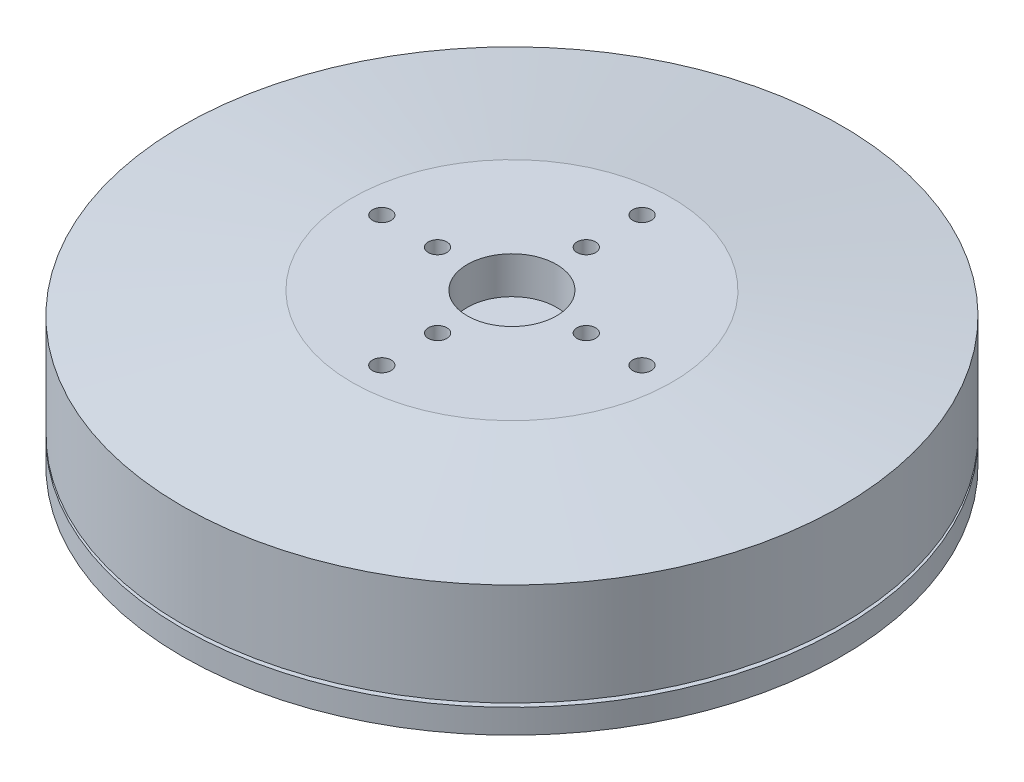
ISO-10303-21;
HEADER;
FILE_DESCRIPTION(('STEP AP214'),'2;1');
FILE_NAME('part.step','',(''),(''),'','','');
FILE_SCHEMA(('AUTOMOTIVE_DESIGN { 1 0 10303 214 1 1 1 1 }'));
ENDSEC;
DATA;
#1=APPLICATION_CONTEXT('core data for automotive mechanical design processes');
#2=APPLICATION_PROTOCOL_DEFINITION('international standard','automotive_design',2000,#1);
#3=PRODUCT_CONTEXT('',#1,'mechanical');
#4=PRODUCT('Part','Part','',(#3));
#5=PRODUCT_RELATED_PRODUCT_CATEGORY('part','',(#4));
#6=PRODUCT_DEFINITION_FORMATION('','',#4);
#7=PRODUCT_DEFINITION_CONTEXT('part definition',#1,'design');
#8=PRODUCT_DEFINITION('design','',#6,#7);
#9=PRODUCT_DEFINITION_SHAPE('','',#8);
#10=(LENGTH_UNIT() NAMED_UNIT(*) SI_UNIT(.MILLI.,.METRE.));
#11=(NAMED_UNIT(*) PLANE_ANGLE_UNIT() SI_UNIT($,.RADIAN.));
#12=(NAMED_UNIT(*) SI_UNIT($,.STERADIAN.) SOLID_ANGLE_UNIT());
#13=UNCERTAINTY_MEASURE_WITH_UNIT(LENGTH_MEASURE(1.E-05),#10,'distance_accuracy_value','');
#14=(GEOMETRIC_REPRESENTATION_CONTEXT(3) GLOBAL_UNCERTAINTY_ASSIGNED_CONTEXT((#13)) GLOBAL_UNIT_ASSIGNED_CONTEXT((#10,
#11,#12)) REPRESENTATION_CONTEXT('',''));
#15=CARTESIAN_POINT('',(0.,0.,0.));
#16=DIRECTION('',(0.,0.,1.));
#17=DIRECTION('',(1.,0.,0.));
#18=AXIS2_PLACEMENT_3D('',#15,#16,#17);
#19=CARTESIAN_POINT('',(-35.,-10.75,0.));
#20=DIRECTION('',(0.,-1.,0.));
#21=DIRECTION('',(0.,0.,-1.));
#22=AXIS2_PLACEMENT_3D('',#19,#20,#21);
#23=PLANE('',#22);
#24=CARTESIAN_POINT('',(0.,-10.75,-15.));
#25=DIRECTION('',(0.,-1.,0.));
#26=DIRECTION('',(0.,0.,-1.));
#27=AXIS2_PLACEMENT_3D('',#24,#25,#26);
#28=CIRCLE('',#27,1.24999999999999);
#29=CARTESIAN_POINT('',(0.,-10.75,-16.25));
#30=VERTEX_POINT('',#29);
#31=EDGE_CURVE('E93',#30,#30,#28,.T.);
#32=ORIENTED_EDGE('',*,*,#31,.F.);
#33=EDGE_LOOP('',(#32));
#34=FACE_BOUND('',#33,.T.);
#35=CARTESIAN_POINT('',(-15.0000000000004,-10.75,-4.24488671257339E-13));
#36=DIRECTION('',(0.,-1.,0.));
#37=DIRECTION('',(0.,0.,-1.));
#38=AXIS2_PLACEMENT_3D('',#35,#36,#37);
#39=CIRCLE('',#38,1.24999999999999);
#40=CARTESIAN_POINT('',(-15.0000000000004,-10.75,-1.25000000000041));
#41=VERTEX_POINT('',#40);
#42=EDGE_CURVE('E92',#41,#41,#39,.T.);
#43=ORIENTED_EDGE('',*,*,#42,.F.);
#44=EDGE_LOOP('',(#43));
#45=FACE_BOUND('',#44,.T.);
#46=CARTESIAN_POINT('',(-8.48977342514678E-13,-10.75,15.));
#47=DIRECTION('',(0.,-1.,0.));
#48=DIRECTION('',(0.,0.,-1.));
#49=AXIS2_PLACEMENT_3D('',#46,#47,#48);
#50=CIRCLE('',#49,1.24999999999999);
#51=CARTESIAN_POINT('',(-8.48977342514678E-13,-10.75,13.75));
#52=VERTEX_POINT('',#51);
#53=EDGE_CURVE('E103',#52,#52,#50,.T.);
#54=ORIENTED_EDGE('',*,*,#53,.F.);
#55=EDGE_LOOP('',(#54));
#56=FACE_BOUND('',#55,.T.);
#57=CARTESIAN_POINT('',(14.9999999999996,-10.75,4.22651701058618E-13));
#58=DIRECTION('',(0.,-1.,0.));
#59=DIRECTION('',(0.,0.,-1.));
#60=AXIS2_PLACEMENT_3D('',#57,#58,#59);
#61=CIRCLE('',#60,1.24999999999999);
#62=CARTESIAN_POINT('',(14.9999999999996,-10.75,-1.24999999999956));
#63=VERTEX_POINT('',#62);
#64=EDGE_CURVE('E109',#63,#63,#61,.T.);
#65=ORIENTED_EDGE('',*,*,#64,.F.);
#66=EDGE_LOOP('',(#65));
#67=FACE_BOUND('',#66,.T.);
#68=CARTESIAN_POINT('',(0.,-10.75,0.));
#69=DIRECTION('',(0.,1.,0.));
#70=DIRECTION('',(0.,0.,1.));
#71=AXIS2_PLACEMENT_3D('',#68,#69,#70);
#72=CIRCLE('',#71,35.);
#73=CARTESIAN_POINT('',(0.,-10.75,35.));
#74=VERTEX_POINT('',#73);
#75=EDGE_CURVE('E169',#74,#74,#72,.T.);
#76=ORIENTED_EDGE('',*,*,#75,.F.);
#77=EDGE_LOOP('',(#76));
#78=FACE_BOUND('',#77,.T.);
#79=ADVANCED_FACE('F38',(#34,#45,#56,#67,#78),#23,.T.);
#80=CARTESIAN_POINT('',(0.,10.75,0.));
#81=DIRECTION('',(0.,1.,0.));
#82=DIRECTION('',(0.,0.,1.));
#83=AXIS2_PLACEMENT_3D('',#80,#81,#82);
#84=PLANE('',#83);
#85=CARTESIAN_POINT('',(0.,10.75,0.));
#86=DIRECTION('',(0.,1.,0.));
#87=DIRECTION('',(0.,0.,1.));
#88=AXIS2_PLACEMENT_3D('',#85,#86,#87);
#89=CIRCLE('',#88,6.);
#90=CARTESIAN_POINT('',(0.,10.75,6.));
#91=VERTEX_POINT('',#90);
#92=EDGE_CURVE('E115',#91,#91,#89,.T.);
#93=ORIENTED_EDGE('',*,*,#92,.F.);
#94=EDGE_LOOP('',(#93));
#95=FACE_BOUND('',#94,.T.);
#96=CARTESIAN_POINT('',(0.,10.75,-17.5));
#97=DIRECTION('',(0.,1.,0.));
#98=DIRECTION('',(0.,0.,1.));
#99=AXIS2_PLACEMENT_3D('',#96,#97,#98);
#100=CIRCLE('',#99,1.24999999999999);
#101=CARTESIAN_POINT('',(0.,10.75,-16.25));
#102=VERTEX_POINT('',#101);
#103=EDGE_CURVE('E119',#102,#102,#100,.T.);
#104=ORIENTED_EDGE('',*,*,#103,.F.);
#105=EDGE_LOOP('',(#104));
#106=FACE_BOUND('',#105,.T.);
#107=CARTESIAN_POINT('',(0.,10.75,-10.));
#108=DIRECTION('',(0.,1.,0.));
#109=DIRECTION('',(0.,0.,1.));
#110=AXIS2_PLACEMENT_3D('',#107,#108,#109);
#111=CIRCLE('',#110,1.24999999999999);
#112=CARTESIAN_POINT('',(0.,10.75,-8.75000000000001));
#113=VERTEX_POINT('',#112);
#114=EDGE_CURVE('E127',#113,#113,#111,.T.);
#115=ORIENTED_EDGE('',*,*,#114,.F.);
#116=EDGE_LOOP('',(#115));
#117=FACE_BOUND('',#116,.T.);
#118=CARTESIAN_POINT('',(17.5000000000003,10.75,-2.83451690054573E-13));
#119=DIRECTION('',(0.,1.,0.));
#120=DIRECTION('',(0.,0.,1.));
#121=AXIS2_PLACEMENT_3D('',#118,#119,#120);
#122=CIRCLE('',#121,1.24999999999999);
#123=CARTESIAN_POINT('',(17.5000000000003,10.75,1.24999999999971));
#124=VERTEX_POINT('',#123);
#125=EDGE_CURVE('E133',#124,#124,#122,.T.);
#126=ORIENTED_EDGE('',*,*,#125,.F.);
#127=EDGE_LOOP('',(#126));
#128=FACE_BOUND('',#127,.T.);
#129=CARTESIAN_POINT('',(10.0000000000003,10.75,-2.82992447504893E-13));
#130=DIRECTION('',(0.,1.,0.));
#131=DIRECTION('',(0.,0.,1.));
#132=AXIS2_PLACEMENT_3D('',#129,#130,#131);
#133=CIRCLE('',#132,1.24999999999999);
#134=CARTESIAN_POINT('',(10.0000000000003,10.75,1.24999999999971));
#135=VERTEX_POINT('',#134);
#136=EDGE_CURVE('E139',#135,#135,#133,.T.);
#137=ORIENTED_EDGE('',*,*,#136,.F.);
#138=EDGE_LOOP('',(#137));
#139=FACE_BOUND('',#138,.T.);
#140=CARTESIAN_POINT('',(5.66903380109146E-13,10.75,17.5));
#141=DIRECTION('',(0.,1.,0.));
#142=DIRECTION('',(0.,0.,1.));
#143=AXIS2_PLACEMENT_3D('',#140,#141,#142);
#144=CIRCLE('',#143,1.24999999999999);
#145=CARTESIAN_POINT('',(5.66903380109146E-13,10.75,18.75));
#146=VERTEX_POINT('',#145);
#147=EDGE_CURVE('E145',#146,#146,#144,.T.);
#148=ORIENTED_EDGE('',*,*,#147,.F.);
#149=EDGE_LOOP('',(#148));
#150=FACE_BOUND('',#149,.T.);
#151=CARTESIAN_POINT('',(5.65984895009786E-13,10.75,10.));
#152=DIRECTION('',(0.,1.,0.));
#153=DIRECTION('',(0.,0.,1.));
#154=AXIS2_PLACEMENT_3D('',#151,#152,#153);
#155=CIRCLE('',#154,1.24999999999999);
#156=CARTESIAN_POINT('',(5.65984895009786E-13,10.75,11.25));
#157=VERTEX_POINT('',#156);
#158=EDGE_CURVE('E151',#157,#157,#155,.T.);
#159=ORIENTED_EDGE('',*,*,#158,.F.);
#160=EDGE_LOOP('',(#159));
#161=FACE_BOUND('',#160,.T.);
#162=CARTESIAN_POINT('',(-17.4999999999997,10.75,2.81308558156065E-13));
#163=DIRECTION('',(0.,1.,0.));
#164=DIRECTION('',(0.,0.,1.));
#165=AXIS2_PLACEMENT_3D('',#162,#163,#164);
#166=CIRCLE('',#165,1.24999999999999);
#167=CARTESIAN_POINT('',(-17.4999999999997,10.75,1.25000000000027));
#168=VERTEX_POINT('',#167);
#169=EDGE_CURVE('E157',#168,#168,#166,.T.);
#170=ORIENTED_EDGE('',*,*,#169,.F.);
#171=EDGE_LOOP('',(#170));
#172=FACE_BOUND('',#171,.T.);
#173=CARTESIAN_POINT('',(-9.99999999999972,10.75,2.81767800705745E-13));
#174=DIRECTION('',(0.,1.,0.));
#175=DIRECTION('',(0.,0.,1.));
#176=AXIS2_PLACEMENT_3D('',#173,#174,#175);
#177=CIRCLE('',#176,1.24999999999999);
#178=CARTESIAN_POINT('',(-9.99999999999972,10.75,1.25000000000027));
#179=VERTEX_POINT('',#178);
#180=EDGE_CURVE('E163',#179,#179,#177,.T.);
#181=ORIENTED_EDGE('',*,*,#180,.F.);
#182=EDGE_LOOP('',(#181));
#183=FACE_BOUND('',#182,.T.);
#184=CARTESIAN_POINT('',(0.,10.75,0.));
#185=DIRECTION('',(0.,1.,0.));
#186=DIRECTION('',(0.,0.,1.));
#187=AXIS2_PLACEMENT_3D('',#184,#185,#186);
#188=CIRCLE('',#187,21.5);
#189=CARTESIAN_POINT('',(0.,10.75,21.5));
#190=VERTEX_POINT('',#189);
#191=EDGE_CURVE('E11',#190,#190,#188,.T.);
#192=ORIENTED_EDGE('',*,*,#191,.T.);
#193=EDGE_LOOP('',(#192));
#194=FACE_BOUND('',#193,.T.);
#195=ADVANCED_FACE('F204',(#95,#106,#117,#128,#139,#150,#161,#172,#183,#194),#84,.T.);
#196=CARTESIAN_POINT('',(0.,10.75,0.));
#197=DIRECTION('',(0.,-1.,0.));
#198=DIRECTION('',(0.,0.,-1.));
#199=AXIS2_PLACEMENT_3D('',#196,#197,#198);
#200=CONICAL_SURFACE('',#199,21.5,1.44011059785878);
#201=CARTESIAN_POINT('',(0.,7.75,0.));
#202=DIRECTION('',(0.,1.,0.));
#203=DIRECTION('',(0.,0.,1.));
#204=AXIS2_PLACEMENT_3D('',#201,#202,#203);
#205=CIRCLE('',#204,44.325);
#206=CARTESIAN_POINT('',(0.,7.75,44.325));
#207=VERTEX_POINT('',#206);
#208=EDGE_CURVE('E45',#207,#207,#205,.T.);
#209=ORIENTED_EDGE('',*,*,#208,.T.);
#210=EDGE_LOOP('',(#209));
#211=FACE_BOUND('',#210,.T.);
#212=ORIENTED_EDGE('',*,*,#191,.F.);
#213=EDGE_LOOP('',(#212));
#214=FACE_BOUND('',#213,.T.);
#215=ADVANCED_FACE('F189',(#211,#214),#200,.T.);
#216=CARTESIAN_POINT('',(0.,0.,0.));
#217=DIRECTION('',(0.,1.,0.));
#218=DIRECTION('',(0.,0.,1.));
#219=AXIS2_PLACEMENT_3D('',#216,#217,#218);
#220=CYLINDRICAL_SURFACE('',#219,44.325);
#221=CARTESIAN_POINT('',(0.,-6.,0.));
#222=DIRECTION('',(0.,1.,0.));
#223=DIRECTION('',(0.,0.,1.));
#224=AXIS2_PLACEMENT_3D('',#221,#222,#223);
#225=CIRCLE('',#224,44.325);
#226=CARTESIAN_POINT('',(0.,-6.,44.325));
#227=VERTEX_POINT('',#226);
#228=EDGE_CURVE('E184',#227,#227,#225,.T.);
#229=ORIENTED_EDGE('',*,*,#228,.T.);
#230=EDGE_LOOP('',(#229));
#231=FACE_BOUND('',#230,.T.);
#232=ORIENTED_EDGE('',*,*,#208,.F.);
#233=EDGE_LOOP('',(#232));
#234=FACE_BOUND('',#233,.T.);
#235=ADVANCED_FACE('F192',(#231,#234),#220,.T.);
#236=CARTESIAN_POINT('',(-44.325,-6.,0.));
#237=DIRECTION('',(0.,-1.,0.));
#238=DIRECTION('',(0.,0.,-1.));
#239=AXIS2_PLACEMENT_3D('',#236,#237,#238);
#240=PLANE('',#239);
#241=CARTESIAN_POINT('',(0.,-6.,0.));
#242=DIRECTION('',(0.,1.,0.));
#243=DIRECTION('',(0.,0.,1.));
#244=AXIS2_PLACEMENT_3D('',#241,#242,#243);
#245=CIRCLE('',#244,40.7624999999992);
#246=CARTESIAN_POINT('',(0.,-6.,40.7624999999992));
#247=VERTEX_POINT('',#246);
#248=EDGE_CURVE('E181',#247,#247,#245,.T.);
#249=ORIENTED_EDGE('',*,*,#248,.T.);
#250=EDGE_LOOP('',(#249));
#251=FACE_BOUND('',#250,.T.);
#252=ORIENTED_EDGE('',*,*,#228,.F.);
#253=EDGE_LOOP('',(#252));
#254=FACE_BOUND('',#253,.T.);
#255=ADVANCED_FACE('F194',(#251,#254),#240,.T.);
#256=CARTESIAN_POINT('',(0.,0.,0.));
#257=DIRECTION('',(0.,1.,0.));
#258=DIRECTION('',(0.,0.,1.));
#259=AXIS2_PLACEMENT_3D('',#256,#257,#258);
#260=CYLINDRICAL_SURFACE('',#259,40.7624999999992);
#261=CARTESIAN_POINT('',(0.,-6.5,0.));
#262=DIRECTION('',(0.,1.,0.));
#263=DIRECTION('',(0.,0.,1.));
#264=AXIS2_PLACEMENT_3D('',#261,#262,#263);
#265=CIRCLE('',#264,40.7624999999992);
#266=CARTESIAN_POINT('',(0.,-6.5,40.7624999999992));
#267=VERTEX_POINT('',#266);
#268=EDGE_CURVE('E178',#267,#267,#265,.T.);
#269=ORIENTED_EDGE('',*,*,#268,.T.);
#270=EDGE_LOOP('',(#269));
#271=FACE_BOUND('',#270,.T.);
#272=ORIENTED_EDGE('',*,*,#248,.F.);
#273=EDGE_LOOP('',(#272));
#274=FACE_BOUND('',#273,.T.);
#275=ADVANCED_FACE('F201',(#271,#274),#260,.T.);
#276=CARTESIAN_POINT('',(-40.7624999999992,-6.5,0.));
#277=DIRECTION('',(0.,1.,0.));
#278=DIRECTION('',(0.,0.,1.));
#279=AXIS2_PLACEMENT_3D('',#276,#277,#278);
#280=PLANE('',#279);
#281=CARTESIAN_POINT('',(0.,-6.5,0.));
#282=DIRECTION('',(0.,1.,0.));
#283=DIRECTION('',(0.,0.,1.));
#284=AXIS2_PLACEMENT_3D('',#281,#282,#283);
#285=CIRCLE('',#284,44.325);
#286=CARTESIAN_POINT('',(0.,-6.5,44.325));
#287=VERTEX_POINT('',#286);
#288=EDGE_CURVE('E175',#287,#287,#285,.T.);
#289=ORIENTED_EDGE('',*,*,#288,.T.);
#290=EDGE_LOOP('',(#289));
#291=FACE_BOUND('',#290,.T.);
#292=ORIENTED_EDGE('',*,*,#268,.F.);
#293=EDGE_LOOP('',(#292));
#294=FACE_BOUND('',#293,.T.);
#295=ADVANCED_FACE('F232',(#291,#294),#280,.T.);
#296=CARTESIAN_POINT('',(0.,0.,0.));
#297=DIRECTION('',(0.,1.,0.));
#298=DIRECTION('',(0.,0.,1.));
#299=AXIS2_PLACEMENT_3D('',#296,#297,#298);
#300=CYLINDRICAL_SURFACE('',#299,44.325);
#301=CARTESIAN_POINT('',(0.,-9.75,0.));
#302=DIRECTION('',(0.,1.,0.));
#303=DIRECTION('',(0.,0.,1.));
#304=AXIS2_PLACEMENT_3D('',#301,#302,#303);
#305=CIRCLE('',#304,44.325);
#306=CARTESIAN_POINT('',(0.,-9.75,44.325));
#307=VERTEX_POINT('',#306);
#308=EDGE_CURVE('E172',#307,#307,#305,.T.);
#309=ORIENTED_EDGE('',*,*,#308,.T.);
#310=EDGE_LOOP('',(#309));
#311=FACE_BOUND('',#310,.T.);
#312=ORIENTED_EDGE('',*,*,#288,.F.);
#313=EDGE_LOOP('',(#312));
#314=FACE_BOUND('',#313,.T.);
#315=ADVANCED_FACE('F226',(#311,#314),#300,.T.);
#316=CARTESIAN_POINT('',(0.,-9.75,0.));
#317=DIRECTION('',(0.,1.,0.));
#318=DIRECTION('',(0.,0.,1.));
#319=AXIS2_PLACEMENT_3D('',#316,#317,#318);
#320=CONICAL_SURFACE('',#319,44.325,1.46396599303283);
#321=ORIENTED_EDGE('',*,*,#75,.T.);
#322=EDGE_LOOP('',(#321));
#323=FACE_BOUND('',#322,.T.);
#324=ORIENTED_EDGE('',*,*,#308,.F.);
#325=EDGE_LOOP('',(#324));
#326=FACE_BOUND('',#325,.T.);
#327=ADVANCED_FACE('F222',(#323,#326),#320,.T.);
#328=CARTESIAN_POINT('',(-9.99999999999972,4.25,2.81767800705745E-13));
#329=DIRECTION('',(0.,1.,0.));
#330=DIRECTION('',(0.,0.,1.));
#331=AXIS2_PLACEMENT_3D('',#328,#329,#330);
#332=CONICAL_SURFACE('',#331,1.25,1.02974425867665);
#333=CARTESIAN_POINT('',(-9.99999999999972,3.49892422621555,2.81767800705745E-13));
#334=VERTEX_POINT('',#333);
#335=VERTEX_LOOP('',#334);
#336=FACE_BOUND('',#335,.T.);
#337=CARTESIAN_POINT('',(-9.99999999999972,4.25,2.81767800705745E-13));
#338=DIRECTION('',(0.,1.,0.));
#339=DIRECTION('',(0.,0.,1.));
#340=AXIS2_PLACEMENT_3D('',#337,#338,#339);
#341=CIRCLE('',#340,1.25);
#342=CARTESIAN_POINT('',(-9.99999999999972,4.25,1.25000000000028));
#343=VERTEX_POINT('',#342);
#344=EDGE_CURVE('E166',#343,#343,#341,.T.);
#345=ORIENTED_EDGE('',*,*,#344,.T.);
#346=EDGE_LOOP('',(#345));
#347=FACE_BOUND('',#346,.T.);
#348=ADVANCED_FACE('F225',(#336,#347),#332,.F.);
#349=CARTESIAN_POINT('',(-9.99999999999972,10.75,2.81767800705745E-13));
#350=DIRECTION('',(0.,1.,0.));
#351=DIRECTION('',(0.,0.,1.));
#352=AXIS2_PLACEMENT_3D('',#349,#350,#351);
#353=CYLINDRICAL_SURFACE('',#352,1.24999999999999);
#354=ORIENTED_EDGE('',*,*,#344,.F.);
#355=EDGE_LOOP('',(#354));
#356=FACE_BOUND('',#355,.T.);
#357=ORIENTED_EDGE('',*,*,#180,.T.);
#358=EDGE_LOOP('',(#357));
#359=FACE_BOUND('',#358,.T.);
#360=ADVANCED_FACE('F252',(#356,#359),#353,.F.);
#361=CARTESIAN_POINT('',(-17.4999999999997,4.25,2.81308558156065E-13));
#362=DIRECTION('',(0.,1.,0.));
#363=DIRECTION('',(0.,0.,1.));
#364=AXIS2_PLACEMENT_3D('',#361,#362,#363);
#365=CONICAL_SURFACE('',#364,1.25,1.02974425867665);
#366=CARTESIAN_POINT('',(-17.4999999999997,3.49892422621555,2.81308558156065E-13));
#367=VERTEX_POINT('',#366);
#368=VERTEX_LOOP('',#367);
#369=FACE_BOUND('',#368,.T.);
#370=CARTESIAN_POINT('',(-17.4999999999997,4.25,2.81308558156065E-13));
#371=DIRECTION('',(0.,1.,0.));
#372=DIRECTION('',(0.,0.,1.));
#373=AXIS2_PLACEMENT_3D('',#370,#371,#372);
#374=CIRCLE('',#373,1.25);
#375=CARTESIAN_POINT('',(-17.4999999999997,4.25,1.25000000000028));
#376=VERTEX_POINT('',#375);
#377=EDGE_CURVE('E160',#376,#376,#374,.T.);
#378=ORIENTED_EDGE('',*,*,#377,.T.);
#379=EDGE_LOOP('',(#378));
#380=FACE_BOUND('',#379,.T.);
#381=ADVANCED_FACE('F255',(#369,#380),#365,.F.);
#382=CARTESIAN_POINT('',(-17.4999999999997,10.75,2.81308558156065E-13));
#383=DIRECTION('',(0.,1.,0.));
#384=DIRECTION('',(0.,0.,1.));
#385=AXIS2_PLACEMENT_3D('',#382,#383,#384);
#386=CYLINDRICAL_SURFACE('',#385,1.24999999999999);
#387=ORIENTED_EDGE('',*,*,#377,.F.);
#388=EDGE_LOOP('',(#387));
#389=FACE_BOUND('',#388,.T.);
#390=ORIENTED_EDGE('',*,*,#169,.T.);
#391=EDGE_LOOP('',(#390));
#392=FACE_BOUND('',#391,.T.);
#393=ADVANCED_FACE('F259',(#389,#392),#386,.F.);
#394=CARTESIAN_POINT('',(5.65984895009786E-13,4.25,10.));
#395=DIRECTION('',(0.,1.,0.));
#396=DIRECTION('',(0.,0.,1.));
#397=AXIS2_PLACEMENT_3D('',#394,#395,#396);
#398=CONICAL_SURFACE('',#397,1.25,1.02974425867665);
#399=CARTESIAN_POINT('',(5.64208893662437E-13,3.49892422621555,10.));
#400=VERTEX_POINT('',#399);
#401=VERTEX_LOOP('',#400);
#402=FACE_BOUND('',#401,.T.);
#403=CARTESIAN_POINT('',(5.65984895009786E-13,4.25,10.));
#404=DIRECTION('',(0.,1.,0.));
#405=DIRECTION('',(0.,0.,1.));
#406=AXIS2_PLACEMENT_3D('',#403,#404,#405);
#407=CIRCLE('',#406,1.25);
#408=CARTESIAN_POINT('',(5.65984895009786E-13,4.25,11.25));
#409=VERTEX_POINT('',#408);
#410=EDGE_CURVE('E154',#409,#409,#407,.T.);
#411=ORIENTED_EDGE('',*,*,#410,.T.);
#412=EDGE_LOOP('',(#411));
#413=FACE_BOUND('',#412,.T.);
#414=ADVANCED_FACE('F262',(#402,#413),#398,.F.);
#415=CARTESIAN_POINT('',(5.65984895009786E-13,10.75,10.));
#416=DIRECTION('',(0.,1.,0.));
#417=DIRECTION('',(0.,0.,1.));
#418=AXIS2_PLACEMENT_3D('',#415,#416,#417);
#419=CYLINDRICAL_SURFACE('',#418,1.24999999999999);
#420=ORIENTED_EDGE('',*,*,#410,.F.);
#421=EDGE_LOOP('',(#420));
#422=FACE_BOUND('',#421,.T.);
#423=ORIENTED_EDGE('',*,*,#158,.T.);
#424=EDGE_LOOP('',(#423));
#425=FACE_BOUND('',#424,.T.);
#426=ADVANCED_FACE('F266',(#422,#425),#419,.F.);
#427=CARTESIAN_POINT('',(5.66903380109146E-13,4.25,17.5));
#428=DIRECTION('',(0.,1.,0.));
#429=DIRECTION('',(0.,0.,1.));
#430=AXIS2_PLACEMENT_3D('',#427,#428,#429);
#431=CONICAL_SURFACE('',#430,1.25,1.02974425867665);
#432=CARTESIAN_POINT('',(5.65127378761798E-13,3.49892422621555,17.5));
#433=VERTEX_POINT('',#432);
#434=VERTEX_LOOP('',#433);
#435=FACE_BOUND('',#434,.T.);
#436=CARTESIAN_POINT('',(5.66903380109146E-13,4.25,17.5));
#437=DIRECTION('',(0.,1.,0.));
#438=DIRECTION('',(0.,0.,1.));
#439=AXIS2_PLACEMENT_3D('',#436,#437,#438);
#440=CIRCLE('',#439,1.25);
#441=CARTESIAN_POINT('',(5.66903380109146E-13,4.25,18.75));
#442=VERTEX_POINT('',#441);
#443=EDGE_CURVE('E148',#442,#442,#440,.T.);
#444=ORIENTED_EDGE('',*,*,#443,.T.);
#445=EDGE_LOOP('',(#444));
#446=FACE_BOUND('',#445,.T.);
#447=ADVANCED_FACE('F270',(#435,#446),#431,.F.);
#448=CARTESIAN_POINT('',(5.66903380109146E-13,10.75,17.5));
#449=DIRECTION('',(0.,1.,0.));
#450=DIRECTION('',(0.,0.,1.));
#451=AXIS2_PLACEMENT_3D('',#448,#449,#450);
#452=CYLINDRICAL_SURFACE('',#451,1.24999999999999);
#453=ORIENTED_EDGE('',*,*,#443,.F.);
#454=EDGE_LOOP('',(#453));
#455=FACE_BOUND('',#454,.T.);
#456=ORIENTED_EDGE('',*,*,#147,.T.);
#457=EDGE_LOOP('',(#456));
#458=FACE_BOUND('',#457,.T.);
#459=ADVANCED_FACE('F274',(#455,#458),#452,.F.);
#460=CARTESIAN_POINT('',(10.0000000000003,4.25,-2.82992447504893E-13));
#461=DIRECTION('',(0.,1.,0.));
#462=DIRECTION('',(0.,0.,1.));
#463=AXIS2_PLACEMENT_3D('',#460,#461,#462);
#464=CONICAL_SURFACE('',#463,1.25,1.02974425867665);
#465=CARTESIAN_POINT('',(10.0000000000003,3.49892422621555,-2.82992447504893E-13));
#466=VERTEX_POINT('',#465);
#467=VERTEX_LOOP('',#466);
#468=FACE_BOUND('',#467,.T.);
#469=CARTESIAN_POINT('',(10.0000000000003,4.25,-2.82992447504893E-13));
#470=DIRECTION('',(0.,1.,0.));
#471=DIRECTION('',(0.,0.,1.));
#472=AXIS2_PLACEMENT_3D('',#469,#470,#471);
#473=CIRCLE('',#472,1.25);
#474=CARTESIAN_POINT('',(10.0000000000003,4.25,1.24999999999971));
#475=VERTEX_POINT('',#474);
#476=EDGE_CURVE('E142',#475,#475,#473,.T.);
#477=ORIENTED_EDGE('',*,*,#476,.T.);
#478=EDGE_LOOP('',(#477));
#479=FACE_BOUND('',#478,.T.);
#480=ADVANCED_FACE('F278',(#468,#479),#464,.F.);
#481=CARTESIAN_POINT('',(10.0000000000003,10.75,-2.82992447504893E-13));
#482=DIRECTION('',(0.,1.,0.));
#483=DIRECTION('',(0.,0.,1.));
#484=AXIS2_PLACEMENT_3D('',#481,#482,#483);
#485=CYLINDRICAL_SURFACE('',#484,1.24999999999999);
#486=ORIENTED_EDGE('',*,*,#476,.F.);
#487=EDGE_LOOP('',(#486));
#488=FACE_BOUND('',#487,.T.);
#489=ORIENTED_EDGE('',*,*,#136,.T.);
#490=EDGE_LOOP('',(#489));
#491=FACE_BOUND('',#490,.T.);
#492=ADVANCED_FACE('F282',(#488,#491),#485,.F.);
#493=CARTESIAN_POINT('',(17.5000000000003,4.25,-2.83451690054573E-13));
#494=DIRECTION('',(0.,1.,0.));
#495=DIRECTION('',(0.,0.,1.));
#496=AXIS2_PLACEMENT_3D('',#493,#494,#495);
#497=CONICAL_SURFACE('',#496,1.25,1.02974425867665);
#498=CARTESIAN_POINT('',(17.5000000000003,3.49892422621555,-2.83451690054573E-13));
#499=VERTEX_POINT('',#498);
#500=VERTEX_LOOP('',#499);
#501=FACE_BOUND('',#500,.T.);
#502=CARTESIAN_POINT('',(17.5000000000003,4.25,-2.83451690054573E-13));
#503=DIRECTION('',(0.,1.,0.));
#504=DIRECTION('',(0.,0.,1.));
#505=AXIS2_PLACEMENT_3D('',#502,#503,#504);
#506=CIRCLE('',#505,1.25);
#507=CARTESIAN_POINT('',(17.5000000000003,4.25,1.24999999999971));
#508=VERTEX_POINT('',#507);
#509=EDGE_CURVE('E136',#508,#508,#506,.T.);
#510=ORIENTED_EDGE('',*,*,#509,.T.);
#511=EDGE_LOOP('',(#510));
#512=FACE_BOUND('',#511,.T.);
#513=ADVANCED_FACE('F286',(#501,#512),#497,.F.);
#514=CARTESIAN_POINT('',(17.5000000000003,10.75,-2.83451690054573E-13));
#515=DIRECTION('',(0.,1.,0.));
#516=DIRECTION('',(0.,0.,1.));
#517=AXIS2_PLACEMENT_3D('',#514,#515,#516);
#518=CYLINDRICAL_SURFACE('',#517,1.24999999999999);
#519=ORIENTED_EDGE('',*,*,#509,.F.);
#520=EDGE_LOOP('',(#519));
#521=FACE_BOUND('',#520,.T.);
#522=ORIENTED_EDGE('',*,*,#125,.T.);
#523=EDGE_LOOP('',(#522));
#524=FACE_BOUND('',#523,.T.);
#525=ADVANCED_FACE('F290',(#521,#524),#518,.F.);
#526=CARTESIAN_POINT('',(0.,4.25,-10.));
#527=DIRECTION('',(0.,1.,0.));
#528=DIRECTION('',(0.,0.,1.));
#529=AXIS2_PLACEMENT_3D('',#526,#527,#528);
#530=CONICAL_SURFACE('',#529,1.25,1.02974425867665);
#531=CARTESIAN_POINT('',(0.,3.49892422621555,-10.));
#532=VERTEX_POINT('',#531);
#533=VERTEX_LOOP('',#532);
#534=FACE_BOUND('',#533,.T.);
#535=CARTESIAN_POINT('',(0.,4.25,-10.));
#536=DIRECTION('',(0.,1.,0.));
#537=DIRECTION('',(0.,0.,1.));
#538=AXIS2_PLACEMENT_3D('',#535,#536,#537);
#539=CIRCLE('',#538,1.25);
#540=CARTESIAN_POINT('',(0.,4.25,-8.75));
#541=VERTEX_POINT('',#540);
#542=EDGE_CURVE('E130',#541,#541,#539,.T.);
#543=ORIENTED_EDGE('',*,*,#542,.T.);
#544=EDGE_LOOP('',(#543));
#545=FACE_BOUND('',#544,.T.);
#546=ADVANCED_FACE('F294',(#534,#545),#530,.F.);
#547=CARTESIAN_POINT('',(0.,10.75,-10.));
#548=DIRECTION('',(0.,1.,0.));
#549=DIRECTION('',(0.,0.,1.));
#550=AXIS2_PLACEMENT_3D('',#547,#548,#549);
#551=CYLINDRICAL_SURFACE('',#550,1.24999999999999);
#552=ORIENTED_EDGE('',*,*,#542,.F.);
#553=EDGE_LOOP('',(#552));
#554=FACE_BOUND('',#553,.T.);
#555=ORIENTED_EDGE('',*,*,#114,.T.);
#556=EDGE_LOOP('',(#555));
#557=FACE_BOUND('',#556,.T.);
#558=ADVANCED_FACE('F298',(#554,#557),#551,.F.);
#559=CARTESIAN_POINT('',(0.,4.25,-17.5));
#560=DIRECTION('',(0.,1.,0.));
#561=DIRECTION('',(0.,0.,1.));
#562=AXIS2_PLACEMENT_3D('',#559,#560,#561);
#563=CONICAL_SURFACE('',#562,1.25,1.02974425867665);
#564=CARTESIAN_POINT('',(0.,3.49892422621555,-17.5));
#565=VERTEX_POINT('',#564);
#566=VERTEX_LOOP('',#565);
#567=FACE_BOUND('',#566,.T.);
#568=CARTESIAN_POINT('',(0.,4.25,-17.5));
#569=DIRECTION('',(0.,1.,0.));
#570=DIRECTION('',(0.,0.,1.));
#571=AXIS2_PLACEMENT_3D('',#568,#569,#570);
#572=CIRCLE('',#571,1.25);
#573=CARTESIAN_POINT('',(0.,4.25,-16.25));
#574=VERTEX_POINT('',#573);
#575=EDGE_CURVE('E124',#574,#574,#572,.T.);
#576=ORIENTED_EDGE('',*,*,#575,.T.);
#577=EDGE_LOOP('',(#576));
#578=FACE_BOUND('',#577,.T.);
#579=ADVANCED_FACE('F302',(#567,#578),#563,.F.);
#580=CARTESIAN_POINT('',(0.,10.75,-17.5));
#581=DIRECTION('',(0.,1.,0.));
#582=DIRECTION('',(0.,0.,1.));
#583=AXIS2_PLACEMENT_3D('',#580,#581,#582);
#584=CYLINDRICAL_SURFACE('',#583,1.24999999999999);
#585=ORIENTED_EDGE('',*,*,#575,.F.);
#586=EDGE_LOOP('',(#585));
#587=FACE_BOUND('',#586,.T.);
#588=ORIENTED_EDGE('',*,*,#103,.T.);
#589=EDGE_LOOP('',(#588));
#590=FACE_BOUND('',#589,.T.);
#591=ADVANCED_FACE('F306',(#587,#590),#584,.F.);
#592=CARTESIAN_POINT('',(0.,5.75,0.));
#593=DIRECTION('',(0.,1.,0.));
#594=DIRECTION('',(0.,0.,1.));
#595=AXIS2_PLACEMENT_3D('',#592,#593,#594);
#596=CYLINDRICAL_SURFACE('',#595,6.);
#597=CARTESIAN_POINT('',(0.,5.75,0.));
#598=DIRECTION('',(0.,1.,0.));
#599=DIRECTION('',(0.,0.,1.));
#600=AXIS2_PLACEMENT_3D('',#597,#598,#599);
#601=CIRCLE('',#600,6.);
#602=CARTESIAN_POINT('',(0.,5.75,6.));
#603=VERTEX_POINT('',#602);
#604=EDGE_CURVE('E116',#603,#603,#601,.T.);
#605=ORIENTED_EDGE('',*,*,#604,.F.);
#606=EDGE_LOOP('',(#605));
#607=FACE_BOUND('',#606,.T.);
#608=ORIENTED_EDGE('',*,*,#92,.T.);
#609=EDGE_LOOP('',(#608));
#610=FACE_BOUND('',#609,.T.);
#611=ADVANCED_FACE('F310',(#607,#610),#596,.F.);
#612=CARTESIAN_POINT('',(0.,5.75,0.));
#613=DIRECTION('',(0.,1.,0.));
#614=DIRECTION('',(0.,0.,1.));
#615=AXIS2_PLACEMENT_3D('',#612,#613,#614);
#616=PLANE('',#615);
#617=ORIENTED_EDGE('',*,*,#604,.T.);
#618=EDGE_LOOP('',(#617));
#619=FACE_BOUND('',#618,.T.);
#620=ADVANCED_FACE('F314',(#619),#616,.T.);
#621=CARTESIAN_POINT('',(14.9999999999996,-4.24999999999999,4.22651701058618E-13));
#622=DIRECTION('',(0.,-1.,0.));
#623=DIRECTION('',(0.,0.,-1.));
#624=AXIS2_PLACEMENT_3D('',#621,#622,#623);
#625=CONICAL_SURFACE('',#624,1.24999999999999,1.02974425867665);
#626=CARTESIAN_POINT('',(14.9999999999996,-3.49892422621555,4.22651701058618E-13));
#627=VERTEX_POINT('',#626);
#628=VERTEX_LOOP('',#627);
#629=FACE_BOUND('',#628,.T.);
#630=CARTESIAN_POINT('',(14.9999999999996,-4.24999999999999,4.22651701058618E-13));
#631=DIRECTION('',(0.,-1.,0.));
#632=DIRECTION('',(0.,0.,-1.));
#633=AXIS2_PLACEMENT_3D('',#630,#631,#632);
#634=CIRCLE('',#633,1.24999999999999);
#635=CARTESIAN_POINT('',(14.9999999999996,-4.24999999999999,-1.24999999999956));
#636=VERTEX_POINT('',#635);
#637=EDGE_CURVE('E112',#636,#636,#634,.T.);
#638=ORIENTED_EDGE('',*,*,#637,.T.);
#639=EDGE_LOOP('',(#638));
#640=FACE_BOUND('',#639,.T.);
#641=ADVANCED_FACE('F318',(#629,#640),#625,.F.);
#642=CARTESIAN_POINT('',(14.9999999999996,-10.75,4.22651701058618E-13));
#643=DIRECTION('',(0.,-1.,0.));
#644=DIRECTION('',(0.,0.,-1.));
#645=AXIS2_PLACEMENT_3D('',#642,#643,#644);
#646=CYLINDRICAL_SURFACE('',#645,1.24999999999999);
#647=ORIENTED_EDGE('',*,*,#637,.F.);
#648=EDGE_LOOP('',(#647));
#649=FACE_BOUND('',#648,.T.);
#650=ORIENTED_EDGE('',*,*,#64,.T.);
#651=EDGE_LOOP('',(#650));
#652=FACE_BOUND('',#651,.T.);
#653=ADVANCED_FACE('F322',(#649,#652),#646,.F.);
#654=CARTESIAN_POINT('',(-8.48977342514678E-13,-4.24999999999999,15.));
#655=DIRECTION('',(0.,-1.,0.));
#656=DIRECTION('',(0.,0.,-1.));
#657=AXIS2_PLACEMENT_3D('',#654,#655,#656);
#658=CONICAL_SURFACE('',#657,1.24999999999999,1.02974425867665);
#659=CARTESIAN_POINT('',(-8.50372479029757E-13,-3.49892422621555,15.));
#660=VERTEX_POINT('',#659);
#661=VERTEX_LOOP('',#660);
#662=FACE_BOUND('',#661,.T.);
#663=CARTESIAN_POINT('',(-8.48977342514678E-13,-4.24999999999999,15.));
#664=DIRECTION('',(0.,-1.,0.));
#665=DIRECTION('',(0.,0.,-1.));
#666=AXIS2_PLACEMENT_3D('',#663,#664,#665);
#667=CIRCLE('',#666,1.24999999999999);
#668=CARTESIAN_POINT('',(-8.48977342514678E-13,-4.24999999999999,13.75));
#669=VERTEX_POINT('',#668);
#670=EDGE_CURVE('E106',#669,#669,#667,.T.);
#671=ORIENTED_EDGE('',*,*,#670,.T.);
#672=EDGE_LOOP('',(#671));
#673=FACE_BOUND('',#672,.T.);
#674=ADVANCED_FACE('F326',(#662,#673),#658,.F.);
#675=CARTESIAN_POINT('',(-8.48977342514678E-13,-10.75,15.));
#676=DIRECTION('',(0.,-1.,0.));
#677=DIRECTION('',(0.,0.,-1.));
#678=AXIS2_PLACEMENT_3D('',#675,#676,#677);
#679=CYLINDRICAL_SURFACE('',#678,1.24999999999999);
#680=ORIENTED_EDGE('',*,*,#670,.F.);
#681=EDGE_LOOP('',(#680));
#682=FACE_BOUND('',#681,.T.);
#683=ORIENTED_EDGE('',*,*,#53,.T.);
#684=EDGE_LOOP('',(#683));
#685=FACE_BOUND('',#684,.T.);
#686=ADVANCED_FACE('F330',(#682,#685),#679,.F.);
#687=CARTESIAN_POINT('',(-15.0000000000004,-4.24999999999999,-4.24488671257339E-13));
#688=DIRECTION('',(0.,-1.,0.));
#689=DIRECTION('',(0.,0.,-1.));
#690=AXIS2_PLACEMENT_3D('',#687,#688,#689);
#691=CONICAL_SURFACE('',#690,1.24999999999999,1.02974425867665);
#692=CARTESIAN_POINT('',(-15.0000000000004,-3.49892422621555,-4.24488671257339E-13));
#693=VERTEX_POINT('',#692);
#694=VERTEX_LOOP('',#693);
#695=FACE_BOUND('',#694,.T.);
#696=CARTESIAN_POINT('',(-15.0000000000004,-4.24999999999999,-4.24488671257339E-13));
#697=DIRECTION('',(0.,-1.,0.));
#698=DIRECTION('',(0.,0.,-1.));
#699=AXIS2_PLACEMENT_3D('',#696,#697,#698);
#700=CIRCLE('',#699,1.24999999999999);
#701=CARTESIAN_POINT('',(-15.0000000000004,-4.24999999999999,-1.25000000000041));
#702=VERTEX_POINT('',#701);
#703=EDGE_CURVE('E96',#702,#702,#700,.T.);
#704=ORIENTED_EDGE('',*,*,#703,.T.);
#705=EDGE_LOOP('',(#704));
#706=FACE_BOUND('',#705,.T.);
#707=ADVANCED_FACE('F334',(#695,#706),#691,.F.);
#708=CARTESIAN_POINT('',(-15.0000000000004,-10.75,-4.24488671257339E-13));
#709=DIRECTION('',(0.,-1.,0.));
#710=DIRECTION('',(0.,0.,-1.));
#711=AXIS2_PLACEMENT_3D('',#708,#709,#710);
#712=CYLINDRICAL_SURFACE('',#711,1.24999999999999);
#713=ORIENTED_EDGE('',*,*,#703,.F.);
#714=EDGE_LOOP('',(#713));
#715=FACE_BOUND('',#714,.T.);
#716=ORIENTED_EDGE('',*,*,#42,.T.);
#717=EDGE_LOOP('',(#716));
#718=FACE_BOUND('',#717,.T.);
#719=ADVANCED_FACE('F86',(#715,#718),#712,.F.);
#720=CARTESIAN_POINT('',(0.,-4.24999999999999,-15.));
#721=DIRECTION('',(0.,-1.,0.));
#722=DIRECTION('',(0.,0.,-1.));
#723=AXIS2_PLACEMENT_3D('',#720,#721,#722);
#724=CONICAL_SURFACE('',#723,1.24999999999999,1.02974425867665);
#725=CARTESIAN_POINT('',(0.,-3.49892422621555,-15.));
#726=VERTEX_POINT('',#725);
#727=VERTEX_LOOP('',#726);
#728=FACE_BOUND('',#727,.T.);
#729=CARTESIAN_POINT('',(0.,-4.24999999999999,-15.));
#730=DIRECTION('',(0.,-1.,0.));
#731=DIRECTION('',(0.,0.,-1.));
#732=AXIS2_PLACEMENT_3D('',#729,#730,#731);
#733=CIRCLE('',#732,1.24999999999999);
#734=CARTESIAN_POINT('',(0.,-4.24999999999999,-16.25));
#735=VERTEX_POINT('',#734);
#736=EDGE_CURVE('E90',#735,#735,#733,.T.);
#737=ORIENTED_EDGE('',*,*,#736,.T.);
#738=EDGE_LOOP('',(#737));
#739=FACE_BOUND('',#738,.T.);
#740=ADVANCED_FACE('F82',(#728,#739),#724,.F.);
#741=CARTESIAN_POINT('',(0.,-10.75,-15.));
#742=DIRECTION('',(0.,-1.,0.));
#743=DIRECTION('',(0.,0.,-1.));
#744=AXIS2_PLACEMENT_3D('',#741,#742,#743);
#745=CYLINDRICAL_SURFACE('',#744,1.24999999999999);
#746=ORIENTED_EDGE('',*,*,#736,.F.);
#747=EDGE_LOOP('',(#746));
#748=FACE_BOUND('',#747,.T.);
#749=ORIENTED_EDGE('',*,*,#31,.T.);
#750=EDGE_LOOP('',(#749));
#751=FACE_BOUND('',#750,.T.);
#752=ADVANCED_FACE('F85',(#748,#751),#745,.F.);
#753=CLOSED_SHELL('',(#79,#195,#215,#235,#255,#275,#295,#315,#327,#348,#360,#381,#393,#414,#426,
#447,#459,#480,#492,#513,#525,#546,#558,#579,#591,#611,#620,#641,#653,#674,#686,#707,#719,#740,#752));
#754=MANIFOLD_SOLID_BREP('B2',#753);
#755=ADVANCED_BREP_SHAPE_REPRESENTATION('',(#18,#754),#14);
#756=SHAPE_DEFINITION_REPRESENTATION(#9,#755);
ENDSEC;
END-ISO-10303-21;
